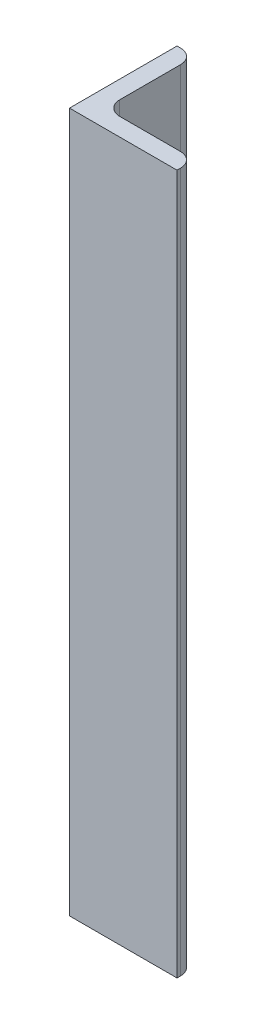
ISO-10303-21;
HEADER;
FILE_DESCRIPTION(('STEP AP214'),'2;1');
FILE_NAME('part.step','',(''),(''),'','','');
FILE_SCHEMA(('AUTOMOTIVE_DESIGN { 1 0 10303 214 1 1 1 1 }'));
ENDSEC;
DATA;
#1=APPLICATION_CONTEXT('core data for automotive mechanical design processes');
#2=APPLICATION_PROTOCOL_DEFINITION('international standard','automotive_design',2000,#1);
#3=PRODUCT_CONTEXT('',#1,'mechanical');
#4=PRODUCT('Part','Part','',(#3));
#5=PRODUCT_RELATED_PRODUCT_CATEGORY('part','',(#4));
#6=PRODUCT_DEFINITION_FORMATION('','',#4);
#7=PRODUCT_DEFINITION_CONTEXT('part definition',#1,'design');
#8=PRODUCT_DEFINITION('design','',#6,#7);
#9=PRODUCT_DEFINITION_SHAPE('','',#8);
#10=(LENGTH_UNIT() NAMED_UNIT(*) SI_UNIT(.MILLI.,.METRE.));
#11=(NAMED_UNIT(*) PLANE_ANGLE_UNIT() SI_UNIT($,.RADIAN.));
#12=(NAMED_UNIT(*) SI_UNIT($,.STERADIAN.) SOLID_ANGLE_UNIT());
#13=UNCERTAINTY_MEASURE_WITH_UNIT(LENGTH_MEASURE(1.E-05),#10,'distance_accuracy_value','');
#14=(GEOMETRIC_REPRESENTATION_CONTEXT(3) GLOBAL_UNCERTAINTY_ASSIGNED_CONTEXT((#13)) GLOBAL_UNIT_ASSIGNED_CONTEXT((#10,
#11,#12)) REPRESENTATION_CONTEXT('',''));
#15=CARTESIAN_POINT('',(0.,0.,0.));
#16=DIRECTION('',(0.,0.,1.));
#17=DIRECTION('',(1.,0.,0.));
#18=AXIS2_PLACEMENT_3D('',#15,#16,#17);
#19=CARTESIAN_POINT('',(19.05,123.952,0.));
#20=DIRECTION('',(0.,0.,-1.));
#21=DIRECTION('',(-1.,0.,0.));
#22=AXIS2_PLACEMENT_3D('',#19,#20,#21);
#23=PLANE('',#22);
#24=DIRECTION('',(1.,0.,0.));
#25=VECTOR('',#24,1.);
#26=CARTESIAN_POINT('',(19.05,0.,0.));
#27=LINE('',#26,#25);
#28=CARTESIAN_POINT('',(0.,0.,0.));
#29=VERTEX_POINT('',#28);
#30=CARTESIAN_POINT('',(19.05,0.,0.));
#31=VERTEX_POINT('',#30);
#32=EDGE_CURVE('E157',#29,#31,#27,.T.);
#33=ORIENTED_EDGE('',*,*,#32,.T.);
#34=DIRECTION('',(0.,-1.,0.));
#35=VECTOR('',#34,1.);
#36=CARTESIAN_POINT('',(19.05,123.952,0.));
#37=LINE('',#36,#35);
#38=CARTESIAN_POINT('',(19.05,123.952,0.));
#39=VERTEX_POINT('',#38);
#40=EDGE_CURVE('E137',#39,#31,#37,.T.);
#41=ORIENTED_EDGE('',*,*,#40,.F.);
#42=DIRECTION('',(1.,0.,0.));
#43=VECTOR('',#42,1.);
#44=CARTESIAN_POINT('',(19.05,123.952,0.));
#45=LINE('',#44,#43);
#46=CARTESIAN_POINT('',(0.,123.952,0.));
#47=VERTEX_POINT('',#46);
#48=EDGE_CURVE('E144',#47,#39,#45,.T.);
#49=ORIENTED_EDGE('',*,*,#48,.F.);
#50=DIRECTION('',(0.,-1.,0.));
#51=VECTOR('',#50,1.);
#52=CARTESIAN_POINT('',(0.,123.952,0.));
#53=LINE('',#52,#51);
#54=EDGE_CURVE('E169',#47,#29,#53,.T.);
#55=ORIENTED_EDGE('',*,*,#54,.T.);
#56=EDGE_LOOP('',(#33,#41,#49,#55));
#57=FACE_BOUND('',#56,.T.);
#58=ADVANCED_FACE('F43',(#57),#23,.F.);
#59=CARTESIAN_POINT('',(19.05,123.952,-3.175));
#60=DIRECTION('',(-1.,0.,0.));
#61=DIRECTION('',(0.,0.,1.));
#62=AXIS2_PLACEMENT_3D('',#59,#60,#61);
#63=PLANE('',#62);
#64=DIRECTION('',(0.,0.,-1.));
#65=VECTOR('',#64,1.);
#66=CARTESIAN_POINT('',(19.05,0.,-3.175));
#67=LINE('',#66,#65);
#68=CARTESIAN_POINT('',(19.05,0.,-0.635000000000003));
#69=VERTEX_POINT('',#68);
#70=EDGE_CURVE('E215',#31,#69,#67,.T.);
#71=ORIENTED_EDGE('',*,*,#70,.T.);
#72=DIRECTION('',(0.,-1.,0.));
#73=VECTOR('',#72,1.);
#74=CARTESIAN_POINT('',(19.05,123.952,-0.635000000000003));
#75=LINE('',#74,#73);
#76=CARTESIAN_POINT('',(19.05,123.952,-0.635000000000003));
#77=VERTEX_POINT('',#76);
#78=EDGE_CURVE('E140',#69,#77,#75,.F.);
#79=ORIENTED_EDGE('',*,*,#78,.T.);
#80=DIRECTION('',(0.,0.,-1.));
#81=VECTOR('',#80,1.);
#82=CARTESIAN_POINT('',(19.05,123.952,-3.175));
#83=LINE('',#82,#81);
#84=EDGE_CURVE('E132',#39,#77,#83,.T.);
#85=ORIENTED_EDGE('',*,*,#84,.F.);
#86=ORIENTED_EDGE('',*,*,#40,.T.);
#87=EDGE_LOOP('',(#71,#79,#85,#86));
#88=FACE_BOUND('',#87,.T.);
#89=ADVANCED_FACE('F135',(#88),#63,.F.);
#90=CARTESIAN_POINT('',(3.175,123.952,-3.175));
#91=DIRECTION('',(0.,0.,1.));
#92=DIRECTION('',(1.,0.,0.));
#93=AXIS2_PLACEMENT_3D('',#90,#91,#92);
#94=PLANE('',#93);
#95=DIRECTION('',(-1.,0.,0.));
#96=VECTOR('',#95,1.);
#97=CARTESIAN_POINT('',(3.175,123.952,-3.175));
#98=LINE('',#97,#96);
#99=CARTESIAN_POINT('',(16.51,123.952,-3.175));
#100=VERTEX_POINT('',#99);
#101=CARTESIAN_POINT('',(5.715,123.952,-3.175));
#102=VERTEX_POINT('',#101);
#103=EDGE_CURVE('E143',#100,#102,#98,.T.);
#104=ORIENTED_EDGE('',*,*,#103,.F.);
#105=DIRECTION('',(0.,-1.,0.));
#106=VECTOR('',#105,1.);
#107=CARTESIAN_POINT('',(16.51,123.952,-3.175));
#108=LINE('',#107,#106);
#109=CARTESIAN_POINT('',(16.51,0.,-3.175));
#110=VERTEX_POINT('',#109);
#111=EDGE_CURVE('E165',#100,#110,#108,.T.);
#112=ORIENTED_EDGE('',*,*,#111,.T.);
#113=DIRECTION('',(-1.,0.,0.));
#114=VECTOR('',#113,1.);
#115=CARTESIAN_POINT('',(3.175,0.,-3.175));
#116=LINE('',#115,#114);
#117=CARTESIAN_POINT('',(5.715,0.,-3.175));
#118=VERTEX_POINT('',#117);
#119=EDGE_CURVE('E205',#110,#118,#116,.T.);
#120=ORIENTED_EDGE('',*,*,#119,.T.);
#121=DIRECTION('',(0.,-1.,0.));
#122=VECTOR('',#121,1.);
#123=CARTESIAN_POINT('',(5.715,123.952,-3.175));
#124=LINE('',#123,#122);
#125=EDGE_CURVE('E159',#118,#102,#124,.F.);
#126=ORIENTED_EDGE('',*,*,#125,.T.);
#127=EDGE_LOOP('',(#104,#112,#120,#126));
#128=FACE_BOUND('',#127,.T.);
#129=ADVANCED_FACE('F212',(#128),#94,.F.);
#130=CARTESIAN_POINT('',(3.175,123.952,-19.05));
#131=DIRECTION('',(-1.,0.,0.));
#132=DIRECTION('',(0.,0.,1.));
#133=AXIS2_PLACEMENT_3D('',#130,#131,#132);
#134=PLANE('',#133);
#135=DIRECTION('',(0.,0.,-1.));
#136=VECTOR('',#135,1.);
#137=CARTESIAN_POINT('',(3.175,0.,-19.05));
#138=LINE('',#137,#136);
#139=CARTESIAN_POINT('',(3.175,0.,-5.715));
#140=VERTEX_POINT('',#139);
#141=CARTESIAN_POINT('',(3.175,0.,-16.51));
#142=VERTEX_POINT('',#141);
#143=EDGE_CURVE('E206',#140,#142,#138,.T.);
#144=ORIENTED_EDGE('',*,*,#143,.T.);
#145=DIRECTION('',(0.,-1.,0.));
#146=VECTOR('',#145,1.);
#147=CARTESIAN_POINT('',(3.175,123.952,-16.51));
#148=LINE('',#147,#146);
#149=CARTESIAN_POINT('',(3.175,123.952,-16.51));
#150=VERTEX_POINT('',#149);
#151=EDGE_CURVE('E71',#142,#150,#148,.F.);
#152=ORIENTED_EDGE('',*,*,#151,.T.);
#153=DIRECTION('',(0.,0.,-1.));
#154=VECTOR('',#153,1.);
#155=CARTESIAN_POINT('',(3.175,123.952,-19.05));
#156=LINE('',#155,#154);
#157=CARTESIAN_POINT('',(3.175,123.952,-5.715));
#158=VERTEX_POINT('',#157);
#159=EDGE_CURVE('E218',#158,#150,#156,.T.);
#160=ORIENTED_EDGE('',*,*,#159,.F.);
#161=DIRECTION('',(0.,-1.,0.));
#162=VECTOR('',#161,1.);
#163=CARTESIAN_POINT('',(3.175,0.,-5.715));
#164=LINE('',#163,#162);
#165=EDGE_CURVE('E192',#158,#140,#164,.T.);
#166=ORIENTED_EDGE('',*,*,#165,.T.);
#167=EDGE_LOOP('',(#144,#152,#160,#166));
#168=FACE_BOUND('',#167,.T.);
#169=ADVANCED_FACE('F219',(#168),#134,.F.);
#170=CARTESIAN_POINT('',(0.,123.952,-19.05));
#171=DIRECTION('',(0.,0.,1.));
#172=DIRECTION('',(1.,0.,0.));
#173=AXIS2_PLACEMENT_3D('',#170,#171,#172);
#174=PLANE('',#173);
#175=DIRECTION('',(-1.,0.,0.));
#176=VECTOR('',#175,1.);
#177=CARTESIAN_POINT('',(0.,123.952,-19.05));
#178=LINE('',#177,#176);
#179=CARTESIAN_POINT('',(0.635,123.952,-19.05));
#180=VERTEX_POINT('',#179);
#181=CARTESIAN_POINT('',(0.,123.952,-19.05));
#182=VERTEX_POINT('',#181);
#183=EDGE_CURVE('E221',#180,#182,#178,.T.);
#184=ORIENTED_EDGE('',*,*,#183,.F.);
#185=DIRECTION('',(0.,-1.,0.));
#186=VECTOR('',#185,1.);
#187=CARTESIAN_POINT('',(0.635,123.952,-19.05));
#188=LINE('',#187,#186);
#189=CARTESIAN_POINT('',(0.635,0.,-19.05));
#190=VERTEX_POINT('',#189);
#191=EDGE_CURVE('E188',#180,#190,#188,.T.);
#192=ORIENTED_EDGE('',*,*,#191,.T.);
#193=DIRECTION('',(-1.,0.,0.));
#194=VECTOR('',#193,1.);
#195=CARTESIAN_POINT('',(0.,0.,-19.05));
#196=LINE('',#195,#194);
#197=CARTESIAN_POINT('',(0.,0.,-19.05));
#198=VERTEX_POINT('',#197);
#199=EDGE_CURVE('E236',#190,#198,#196,.T.);
#200=ORIENTED_EDGE('',*,*,#199,.T.);
#201=DIRECTION('',(0.,-1.,0.));
#202=VECTOR('',#201,1.);
#203=CARTESIAN_POINT('',(0.,123.952,-19.05));
#204=LINE('',#203,#202);
#205=EDGE_CURVE('E160',#182,#198,#204,.T.);
#206=ORIENTED_EDGE('',*,*,#205,.F.);
#207=EDGE_LOOP('',(#184,#192,#200,#206));
#208=FACE_BOUND('',#207,.T.);
#209=ADVANCED_FACE('F264',(#208),#174,.F.);
#210=CARTESIAN_POINT('',(0.,123.952,0.));
#211=DIRECTION('',(1.,0.,0.));
#212=DIRECTION('',(0.,0.,-1.));
#213=AXIS2_PLACEMENT_3D('',#210,#211,#212);
#214=PLANE('',#213);
#215=DIRECTION('',(0.,0.,1.));
#216=VECTOR('',#215,1.);
#217=CARTESIAN_POINT('',(0.,0.,0.));
#218=LINE('',#217,#216);
#219=EDGE_CURVE('E154',#198,#29,#218,.T.);
#220=ORIENTED_EDGE('',*,*,#219,.T.);
#221=ORIENTED_EDGE('',*,*,#54,.F.);
#222=DIRECTION('',(0.,0.,1.));
#223=VECTOR('',#222,1.);
#224=CARTESIAN_POINT('',(0.,123.952,0.));
#225=LINE('',#224,#223);
#226=EDGE_CURVE('E149',#182,#47,#225,.T.);
#227=ORIENTED_EDGE('',*,*,#226,.F.);
#228=ORIENTED_EDGE('',*,*,#205,.T.);
#229=EDGE_LOOP('',(#220,#221,#227,#228));
#230=FACE_BOUND('',#229,.T.);
#231=ADVANCED_FACE('F267',(#230),#214,.F.);
#232=CARTESIAN_POINT('',(0.,123.952,0.));
#233=DIRECTION('',(0.,-1.,0.));
#234=DIRECTION('',(0.,0.,-1.));
#235=AXIS2_PLACEMENT_3D('',#232,#233,#234);
#236=PLANE('',#235);
#237=ORIENTED_EDGE('',*,*,#84,.T.);
#238=CARTESIAN_POINT('',(16.51,123.952,-0.635));
#239=DIRECTION('',(0.,-1.,0.));
#240=DIRECTION('',(0.,0.,-1.));
#241=AXIS2_PLACEMENT_3D('',#238,#239,#240);
#242=CIRCLE('',#241,2.54);
#243=EDGE_CURVE('E185',#77,#100,#242,.F.);
#244=ORIENTED_EDGE('',*,*,#243,.T.);
#245=ORIENTED_EDGE('',*,*,#103,.T.);
#246=CARTESIAN_POINT('',(5.715,123.952,-5.715));
#247=DIRECTION('',(0.,-1.,0.));
#248=DIRECTION('',(0.,0.,-1.));
#249=AXIS2_PLACEMENT_3D('',#246,#247,#248);
#250=CIRCLE('',#249,2.54);
#251=EDGE_CURVE('E11',#102,#158,#250,.T.);
#252=ORIENTED_EDGE('',*,*,#251,.T.);
#253=ORIENTED_EDGE('',*,*,#159,.T.);
#254=CARTESIAN_POINT('',(0.635,123.952,-16.51));
#255=DIRECTION('',(0.,-1.,0.));
#256=DIRECTION('',(0.,0.,-1.));
#257=AXIS2_PLACEMENT_3D('',#254,#255,#256);
#258=CIRCLE('',#257,2.54);
#259=EDGE_CURVE('E62',#150,#180,#258,.F.);
#260=ORIENTED_EDGE('',*,*,#259,.T.);
#261=ORIENTED_EDGE('',*,*,#183,.T.);
#262=ORIENTED_EDGE('',*,*,#226,.T.);
#263=ORIENTED_EDGE('',*,*,#48,.T.);
#264=EDGE_LOOP('',(#237,#244,#245,#252,#253,#260,#261,#262,#263));
#265=FACE_BOUND('',#264,.T.);
#266=ADVANCED_FACE('F147',(#265),#236,.F.);
#267=CARTESIAN_POINT('',(0.,0.,0.));
#268=DIRECTION('',(0.,-1.,0.));
#269=DIRECTION('',(0.,0.,-1.));
#270=AXIS2_PLACEMENT_3D('',#267,#268,#269);
#271=PLANE('',#270);
#272=ORIENTED_EDGE('',*,*,#119,.F.);
#273=CARTESIAN_POINT('',(16.51,0.,-0.635));
#274=DIRECTION('',(0.,-1.,0.));
#275=DIRECTION('',(0.,0.,-1.));
#276=AXIS2_PLACEMENT_3D('',#273,#274,#275);
#277=CIRCLE('',#276,2.54);
#278=EDGE_CURVE('E179',#110,#69,#277,.T.);
#279=ORIENTED_EDGE('',*,*,#278,.T.);
#280=ORIENTED_EDGE('',*,*,#70,.F.);
#281=ORIENTED_EDGE('',*,*,#32,.F.);
#282=ORIENTED_EDGE('',*,*,#219,.F.);
#283=ORIENTED_EDGE('',*,*,#199,.F.);
#284=CARTESIAN_POINT('',(0.635,0.,-16.51));
#285=DIRECTION('',(0.,-1.,0.));
#286=DIRECTION('',(0.,0.,-1.));
#287=AXIS2_PLACEMENT_3D('',#284,#285,#286);
#288=CIRCLE('',#287,2.54);
#289=EDGE_CURVE('E176',#190,#142,#288,.T.);
#290=ORIENTED_EDGE('',*,*,#289,.T.);
#291=ORIENTED_EDGE('',*,*,#143,.F.);
#292=CARTESIAN_POINT('',(5.715,0.,-5.715));
#293=DIRECTION('',(0.,-1.,0.));
#294=DIRECTION('',(0.,0.,-1.));
#295=AXIS2_PLACEMENT_3D('',#292,#293,#294);
#296=CIRCLE('',#295,2.54);
#297=EDGE_CURVE('E52',#140,#118,#296,.F.);
#298=ORIENTED_EDGE('',*,*,#297,.T.);
#299=EDGE_LOOP('',(#272,#279,#280,#281,#282,#283,#290,#291,#298));
#300=FACE_BOUND('',#299,.T.);
#301=ADVANCED_FACE('F204',(#300),#271,.T.);
#302=CARTESIAN_POINT('',(16.51,123.952,-0.635));
#303=DIRECTION('',(0.,-1.,0.));
#304=DIRECTION('',(0.,0.,-1.));
#305=AXIS2_PLACEMENT_3D('',#302,#303,#304);
#306=CYLINDRICAL_SURFACE('',#305,2.54);
#307=ORIENTED_EDGE('',*,*,#243,.F.);
#308=ORIENTED_EDGE('',*,*,#78,.F.);
#309=ORIENTED_EDGE('',*,*,#278,.F.);
#310=ORIENTED_EDGE('',*,*,#111,.F.);
#311=EDGE_LOOP('',(#307,#308,#309,#310));
#312=FACE_BOUND('',#311,.T.);
#313=ADVANCED_FACE('F243',(#312),#306,.T.);
#314=CARTESIAN_POINT('',(0.635,123.952,-16.51));
#315=DIRECTION('',(0.,-1.,0.));
#316=DIRECTION('',(0.,0.,-1.));
#317=AXIS2_PLACEMENT_3D('',#314,#315,#316);
#318=CYLINDRICAL_SURFACE('',#317,2.54);
#319=ORIENTED_EDGE('',*,*,#259,.F.);
#320=ORIENTED_EDGE('',*,*,#151,.F.);
#321=ORIENTED_EDGE('',*,*,#289,.F.);
#322=ORIENTED_EDGE('',*,*,#191,.F.);
#323=EDGE_LOOP('',(#319,#320,#321,#322));
#324=FACE_BOUND('',#323,.T.);
#325=ADVANCED_FACE('F245',(#324),#318,.T.);
#326=CARTESIAN_POINT('',(5.715,123.952,-5.715));
#327=DIRECTION('',(0.,1.,0.));
#328=DIRECTION('',(0.,0.,1.));
#329=AXIS2_PLACEMENT_3D('',#326,#327,#328);
#330=CYLINDRICAL_SURFACE('',#329,2.54);
#331=ORIENTED_EDGE('',*,*,#251,.F.);
#332=ORIENTED_EDGE('',*,*,#125,.F.);
#333=ORIENTED_EDGE('',*,*,#297,.F.);
#334=ORIENTED_EDGE('',*,*,#165,.F.);
#335=EDGE_LOOP('',(#331,#332,#333,#334));
#336=FACE_BOUND('',#335,.T.);
#337=ADVANCED_FACE('F45',(#336),#330,.F.);
#338=CLOSED_SHELL('',(#58,#89,#129,#169,#209,#231,#266,#301,#313,#325,#337));
#339=MANIFOLD_SOLID_BREP('B2',#338);
#340=ADVANCED_BREP_SHAPE_REPRESENTATION('',(#18,#339),#14);
#341=SHAPE_DEFINITION_REPRESENTATION(#9,#340);
ENDSEC;
END-ISO-10303-21;
